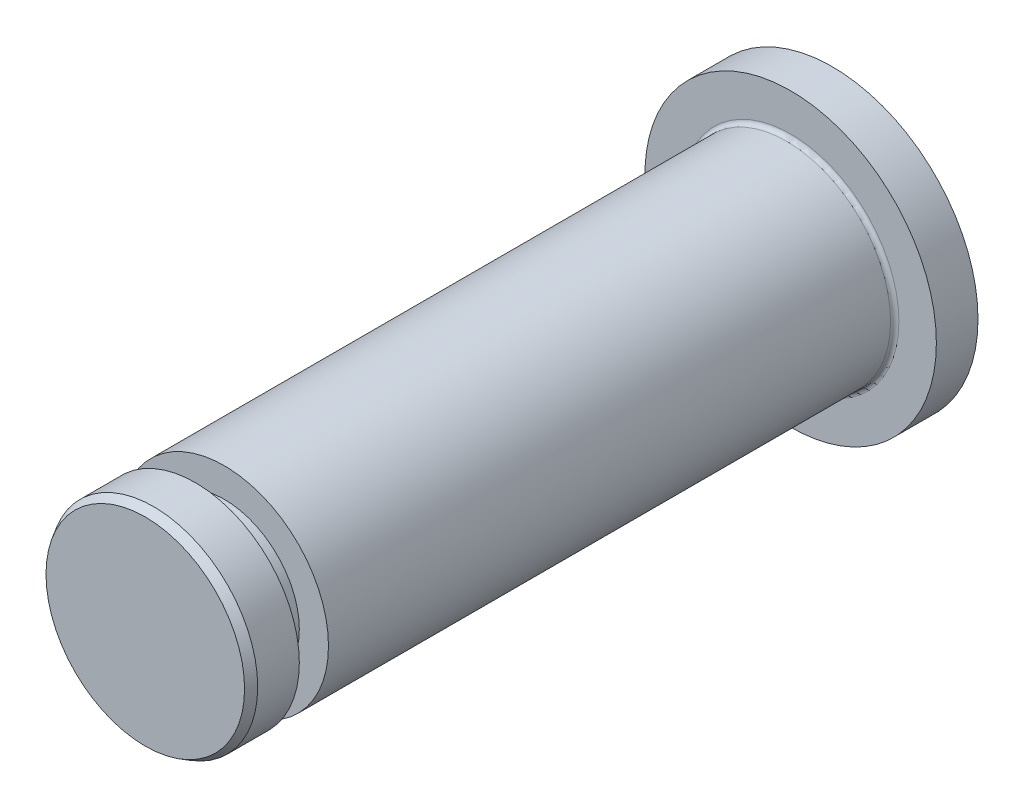
ISO-10303-21;
HEADER;
FILE_DESCRIPTION(('STEP AP214'),'2;1');
FILE_NAME('part.step','',(''),(''),'','','');
FILE_SCHEMA(('AUTOMOTIVE_DESIGN { 1 0 10303 214 1 1 1 1 }'));
ENDSEC;
DATA;
#1=APPLICATION_CONTEXT('core data for automotive mechanical design processes');
#2=APPLICATION_PROTOCOL_DEFINITION('international standard','automotive_design',2000,#1);
#3=PRODUCT_CONTEXT('',#1,'mechanical');
#4=PRODUCT('Part','Part','',(#3));
#5=PRODUCT_RELATED_PRODUCT_CATEGORY('part','',(#4));
#6=PRODUCT_DEFINITION_FORMATION('','',#4);
#7=PRODUCT_DEFINITION_CONTEXT('part definition',#1,'design');
#8=PRODUCT_DEFINITION('design','',#6,#7);
#9=PRODUCT_DEFINITION_SHAPE('','',#8);
#10=(LENGTH_UNIT() NAMED_UNIT(*) SI_UNIT(.MILLI.,.METRE.));
#11=(NAMED_UNIT(*) PLANE_ANGLE_UNIT() SI_UNIT($,.RADIAN.));
#12=(NAMED_UNIT(*) SI_UNIT($,.STERADIAN.) SOLID_ANGLE_UNIT());
#13=UNCERTAINTY_MEASURE_WITH_UNIT(LENGTH_MEASURE(1.E-05),#10,'distance_accuracy_value','');
#14=(GEOMETRIC_REPRESENTATION_CONTEXT(3) GLOBAL_UNCERTAINTY_ASSIGNED_CONTEXT((#13)) GLOBAL_UNIT_ASSIGNED_CONTEXT((#10,
#11,#12)) REPRESENTATION_CONTEXT('',''));
#15=CARTESIAN_POINT('',(0.,0.,0.));
#16=DIRECTION('',(0.,0.,1.));
#17=DIRECTION('',(1.,0.,0.));
#18=AXIS2_PLACEMENT_3D('',#15,#16,#17);
#19=CARTESIAN_POINT('',(0.,0.,146.));
#20=DIRECTION('',(0.,0.,1.));
#21=DIRECTION('',(1.,0.,0.));
#22=AXIS2_PLACEMENT_3D('',#19,#20,#21);
#23=PLANE('',#22);
#24=CARTESIAN_POINT('',(0.,0.,146.));
#25=DIRECTION('',(0.,0.,1.));
#26=DIRECTION('',(1.,0.,0.));
#27=AXIS2_PLACEMENT_3D('',#24,#25,#26);
#28=CIRCLE('',#27,25.);
#29=CARTESIAN_POINT('',(25.,0.,146.));
#30=VERTEX_POINT('',#29);
#31=EDGE_CURVE('E56',#30,#30,#28,.T.);
#32=ORIENTED_EDGE('',*,*,#31,.T.);
#33=EDGE_LOOP('',(#32));
#34=FACE_BOUND('',#33,.T.);
#35=CARTESIAN_POINT('',(0.,0.,146.));
#36=DIRECTION('',(0.,0.,1.));
#37=DIRECTION('',(1.,0.,0.));
#38=AXIS2_PLACEMENT_3D('',#35,#36,#37);
#39=CIRCLE('',#38,18.);
#40=CARTESIAN_POINT('',(18.,0.,146.));
#41=VERTEX_POINT('',#40);
#42=EDGE_CURVE('E62',#41,#41,#39,.T.);
#43=ORIENTED_EDGE('',*,*,#42,.F.);
#44=EDGE_LOOP('',(#43));
#45=FACE_BOUND('',#44,.T.);
#46=ADVANCED_FACE('F32',(#34,#45),#23,.T.);
#47=CARTESIAN_POINT('',(0.,0.,10.));
#48=DIRECTION('',(0.,0.,1.));
#49=DIRECTION('',(1.,0.,0.));
#50=AXIS2_PLACEMENT_3D('',#47,#48,#49);
#51=PLANE('',#50);
#52=CARTESIAN_POINT('',(0.,0.,10.));
#53=DIRECTION('',(0.,0.,1.));
#54=DIRECTION('',(1.,0.,0.));
#55=AXIS2_PLACEMENT_3D('',#52,#53,#54);
#56=CIRCLE('',#55,26.);
#57=CARTESIAN_POINT('',(26.,0.,10.));
#58=VERTEX_POINT('',#57);
#59=EDGE_CURVE('E10',#58,#58,#56,.F.);
#60=ORIENTED_EDGE('',*,*,#59,.T.);
#61=EDGE_LOOP('',(#60));
#62=FACE_BOUND('',#61,.T.);
#63=CARTESIAN_POINT('',(0.,0.,10.));
#64=DIRECTION('',(0.,0.,1.));
#65=DIRECTION('',(1.,0.,0.));
#66=AXIS2_PLACEMENT_3D('',#63,#64,#65);
#67=CIRCLE('',#66,35.);
#68=CARTESIAN_POINT('',(35.,0.,10.));
#69=VERTEX_POINT('',#68);
#70=EDGE_CURVE('E52',#69,#69,#67,.T.);
#71=ORIENTED_EDGE('',*,*,#70,.T.);
#72=EDGE_LOOP('',(#71));
#73=FACE_BOUND('',#72,.T.);
#74=ADVANCED_FACE('F87',(#62,#73),#51,.T.);
#75=CARTESIAN_POINT('',(0.,0.,10.));
#76=DIRECTION('',(0.,0.,-1.));
#77=DIRECTION('',(-1.,0.,0.));
#78=AXIS2_PLACEMENT_3D('',#75,#76,#77);
#79=CYLINDRICAL_SURFACE('',#78,35.);
#80=ORIENTED_EDGE('',*,*,#70,.F.);
#81=EDGE_LOOP('',(#80));
#82=FACE_BOUND('',#81,.T.);
#83=CARTESIAN_POINT('',(0.,0.,0.));
#84=DIRECTION('',(0.,0.,1.));
#85=DIRECTION('',(1.,0.,0.));
#86=AXIS2_PLACEMENT_3D('',#83,#84,#85);
#87=CIRCLE('',#86,35.);
#88=CARTESIAN_POINT('',(35.,0.,0.));
#89=VERTEX_POINT('',#88);
#90=EDGE_CURVE('E53',#89,#89,#87,.T.);
#91=ORIENTED_EDGE('',*,*,#90,.T.);
#92=EDGE_LOOP('',(#91));
#93=FACE_BOUND('',#92,.T.);
#94=ADVANCED_FACE('F93',(#82,#93),#79,.T.);
#95=CARTESIAN_POINT('',(0.,0.,0.));
#96=DIRECTION('',(0.,0.,1.));
#97=DIRECTION('',(1.,0.,0.));
#98=AXIS2_PLACEMENT_3D('',#95,#96,#97);
#99=PLANE('',#98);
#100=ORIENTED_EDGE('',*,*,#90,.F.);
#101=EDGE_LOOP('',(#100));
#102=FACE_BOUND('',#101,.T.);
#103=ADVANCED_FACE('F98',(#102),#99,.F.);
#104=CARTESIAN_POINT('',(0.,0.,146.));
#105=DIRECTION('',(0.,0.,-1.));
#106=DIRECTION('',(-1.,0.,0.));
#107=AXIS2_PLACEMENT_3D('',#104,#105,#106);
#108=CYLINDRICAL_SURFACE('',#107,25.);
#109=CARTESIAN_POINT('',(0.,0.,11.));
#110=DIRECTION('',(0.,0.,1.));
#111=DIRECTION('',(1.,0.,0.));
#112=AXIS2_PLACEMENT_3D('',#109,#110,#111);
#113=CIRCLE('',#112,25.);
#114=CARTESIAN_POINT('',(25.,0.,11.));
#115=VERTEX_POINT('',#114);
#116=EDGE_CURVE('E39',#115,#115,#113,.T.);
#117=ORIENTED_EDGE('',*,*,#116,.T.);
#118=EDGE_LOOP('',(#117));
#119=FACE_BOUND('',#118,.T.);
#120=ORIENTED_EDGE('',*,*,#31,.F.);
#121=EDGE_LOOP('',(#120));
#122=FACE_BOUND('',#121,.T.);
#123=ADVANCED_FACE('F82',(#119,#122),#108,.T.);
#124=CARTESIAN_POINT('',(0.,0.,153.));
#125=DIRECTION('',(0.,0.,-1.));
#126=DIRECTION('',(-1.,0.,0.));
#127=AXIS2_PLACEMENT_3D('',#124,#125,#126);
#128=CYLINDRICAL_SURFACE('',#127,18.);
#129=CARTESIAN_POINT('',(0.,0.,153.));
#130=DIRECTION('',(0.,0.,1.));
#131=DIRECTION('',(1.,0.,0.));
#132=AXIS2_PLACEMENT_3D('',#129,#130,#131);
#133=CIRCLE('',#132,18.);
#134=CARTESIAN_POINT('',(18.,0.,153.));
#135=VERTEX_POINT('',#134);
#136=EDGE_CURVE('E61',#135,#135,#133,.T.);
#137=ORIENTED_EDGE('',*,*,#136,.F.);
#138=EDGE_LOOP('',(#137));
#139=FACE_BOUND('',#138,.T.);
#140=ORIENTED_EDGE('',*,*,#42,.T.);
#141=EDGE_LOOP('',(#140));
#142=FACE_BOUND('',#141,.T.);
#143=ADVANCED_FACE('F76',(#139,#142),#128,.T.);
#144=CARTESIAN_POINT('',(0.,0.,153.));
#145=DIRECTION('',(0.,0.,1.));
#146=DIRECTION('',(1.,0.,0.));
#147=AXIS2_PLACEMENT_3D('',#144,#145,#146);
#148=PLANE('',#147);
#149=CARTESIAN_POINT('',(0.,0.,153.));
#150=DIRECTION('',(0.,0.,1.));
#151=DIRECTION('',(1.,0.,0.));
#152=AXIS2_PLACEMENT_3D('',#149,#150,#151);
#153=CIRCLE('',#152,25.);
#154=CARTESIAN_POINT('',(25.,0.,153.));
#155=VERTEX_POINT('',#154);
#156=EDGE_CURVE('E65',#155,#155,#153,.T.);
#157=ORIENTED_EDGE('',*,*,#156,.F.);
#158=EDGE_LOOP('',(#157));
#159=FACE_BOUND('',#158,.T.);
#160=ORIENTED_EDGE('',*,*,#136,.T.);
#161=EDGE_LOOP('',(#160));
#162=FACE_BOUND('',#161,.T.);
#163=ADVANCED_FACE('F73',(#159,#162),#148,.F.);
#164=CARTESIAN_POINT('',(0.,0.,165.));
#165=DIRECTION('',(0.,0.,-1.));
#166=DIRECTION('',(-1.,0.,0.));
#167=AXIS2_PLACEMENT_3D('',#164,#165,#166);
#168=CYLINDRICAL_SURFACE('',#167,25.);
#169=CARTESIAN_POINT('',(0.,0.,163.));
#170=DIRECTION('',(0.,0.,1.));
#171=DIRECTION('',(1.,0.,0.));
#172=AXIS2_PLACEMENT_3D('',#169,#170,#171);
#173=CIRCLE('',#172,25.);
#174=CARTESIAN_POINT('',(25.,0.,163.));
#175=VERTEX_POINT('',#174);
#176=EDGE_CURVE('E43',#175,#175,#173,.F.);
#177=ORIENTED_EDGE('',*,*,#176,.T.);
#178=EDGE_LOOP('',(#177));
#179=FACE_BOUND('',#178,.T.);
#180=ORIENTED_EDGE('',*,*,#156,.T.);
#181=EDGE_LOOP('',(#180));
#182=FACE_BOUND('',#181,.T.);
#183=ADVANCED_FACE('F71',(#179,#182),#168,.T.);
#184=CARTESIAN_POINT('',(0.,0.,165.));
#185=DIRECTION('',(0.,0.,1.));
#186=DIRECTION('',(1.,0.,0.));
#187=AXIS2_PLACEMENT_3D('',#184,#185,#186);
#188=PLANE('',#187);
#189=CARTESIAN_POINT('',(0.,0.,165.));
#190=DIRECTION('',(0.,0.,1.));
#191=DIRECTION('',(1.,0.,0.));
#192=AXIS2_PLACEMENT_3D('',#189,#190,#191);
#193=CIRCLE('',#192,23.8452994616207);
#194=CARTESIAN_POINT('',(23.8452994616207,0.,165.));
#195=VERTEX_POINT('',#194);
#196=EDGE_CURVE('E47',#195,#195,#193,.T.);
#197=ORIENTED_EDGE('',*,*,#196,.T.);
#198=EDGE_LOOP('',(#197));
#199=FACE_BOUND('',#198,.T.);
#200=ADVANCED_FACE('F107',(#199),#188,.T.);
#201=CARTESIAN_POINT('',(0.,0.,165.));
#202=DIRECTION('',(0.,0.,-1.));
#203=DIRECTION('',(-1.,0.,0.));
#204=AXIS2_PLACEMENT_3D('',#201,#202,#203);
#205=CONICAL_SURFACE('',#204,23.8452994616207,0.523598775598301);
#206=ORIENTED_EDGE('',*,*,#176,.F.);
#207=EDGE_LOOP('',(#206));
#208=FACE_BOUND('',#207,.T.);
#209=ORIENTED_EDGE('',*,*,#196,.F.);
#210=EDGE_LOOP('',(#209));
#211=FACE_BOUND('',#210,.T.);
#212=ADVANCED_FACE('F105',(#208,#211),#205,.T.);
#213=CARTESIAN_POINT('',(0.,0.,11.));
#214=DIRECTION('',(0.,0.,1.));
#215=DIRECTION('',(1.,0.,0.));
#216=AXIS2_PLACEMENT_3D('',#213,#214,#215);
#217=TOROIDAL_SURFACE('',#216,26.,1.);
#218=ORIENTED_EDGE('',*,*,#59,.F.);
#219=EDGE_LOOP('',(#218));
#220=FACE_BOUND('',#219,.T.);
#221=ORIENTED_EDGE('',*,*,#116,.F.);
#222=EDGE_LOOP('',(#221));
#223=FACE_BOUND('',#222,.T.);
#224=ADVANCED_FACE('F34',(#220,#223),#217,.F.);
#225=CLOSED_SHELL('',(#46,#74,#94,#103,#123,#143,#163,#183,#200,#212,#224));
#226=MANIFOLD_SOLID_BREP('B2',#225);
#227=ADVANCED_BREP_SHAPE_REPRESENTATION('',(#18,#226),#14);
#228=SHAPE_DEFINITION_REPRESENTATION(#9,#227);
ENDSEC;
END-ISO-10303-21;
